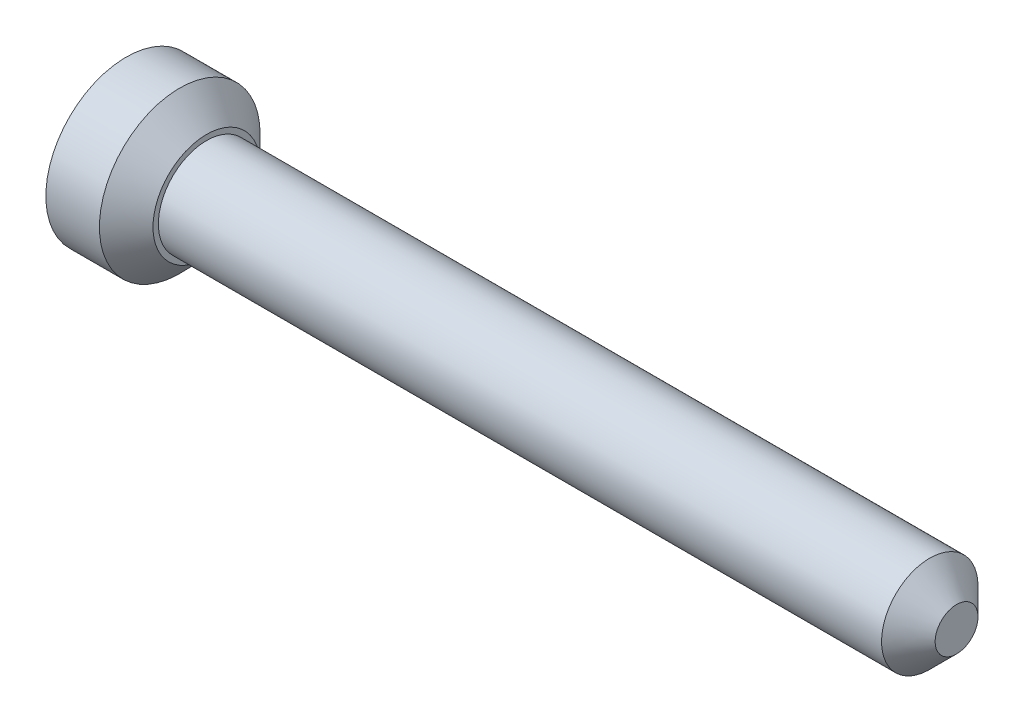
ISO-10303-21;
HEADER;
FILE_DESCRIPTION(('STEP AP214'),'2;1');
FILE_NAME('part.step','',(''),(''),'','','');
FILE_SCHEMA(('AUTOMOTIVE_DESIGN { 1 0 10303 214 1 1 1 1 }'));
ENDSEC;
DATA;
#1=APPLICATION_CONTEXT('core data for automotive mechanical design processes');
#2=APPLICATION_PROTOCOL_DEFINITION('international standard','automotive_design',2000,#1);
#3=PRODUCT_CONTEXT('',#1,'mechanical');
#4=PRODUCT('Part','Part','',(#3));
#5=PRODUCT_RELATED_PRODUCT_CATEGORY('part','',(#4));
#6=PRODUCT_DEFINITION_FORMATION('','',#4);
#7=PRODUCT_DEFINITION_CONTEXT('part definition',#1,'design');
#8=PRODUCT_DEFINITION('design','',#6,#7);
#9=PRODUCT_DEFINITION_SHAPE('','',#8);
#10=(LENGTH_UNIT() NAMED_UNIT(*) SI_UNIT(.MILLI.,.METRE.));
#11=(NAMED_UNIT(*) PLANE_ANGLE_UNIT() SI_UNIT($,.RADIAN.));
#12=(NAMED_UNIT(*) SI_UNIT($,.STERADIAN.) SOLID_ANGLE_UNIT());
#13=UNCERTAINTY_MEASURE_WITH_UNIT(LENGTH_MEASURE(1.E-05),#10,'distance_accuracy_value','');
#14=(GEOMETRIC_REPRESENTATION_CONTEXT(3) GLOBAL_UNCERTAINTY_ASSIGNED_CONTEXT((#13)) GLOBAL_UNIT_ASSIGNED_CONTEXT((#10,
#11,#12)) REPRESENTATION_CONTEXT('',''));
#15=CARTESIAN_POINT('',(0.,0.,0.));
#16=DIRECTION('',(0.,0.,1.));
#17=DIRECTION('',(1.,0.,0.));
#18=AXIS2_PLACEMENT_3D('',#15,#16,#17);
#19=CARTESIAN_POINT('',(14.,0.,0.));
#20=DIRECTION('',(-1.,0.,0.));
#21=DIRECTION('',(0.,0.,1.));
#22=AXIS2_PLACEMENT_3D('',#19,#20,#21);
#23=CYLINDRICAL_SURFACE('',#22,0.9);
#24=CARTESIAN_POINT('',(13.5,0.,0.));
#25=DIRECTION('',(1.,0.,0.));
#26=DIRECTION('',(0.,0.,-1.));
#27=AXIS2_PLACEMENT_3D('',#24,#25,#26);
#28=CIRCLE('',#27,0.9);
#29=CARTESIAN_POINT('',(13.5,0.,-0.9));
#30=VERTEX_POINT('',#29);
#31=EDGE_CURVE('E48',#30,#30,#28,.F.);
#32=ORIENTED_EDGE('',*,*,#31,.T.);
#33=EDGE_LOOP('',(#32));
#34=FACE_BOUND('',#33,.T.);
#35=CARTESIAN_POINT('',(0.,0.,0.));
#36=DIRECTION('',(1.,0.,0.));
#37=DIRECTION('',(0.,0.,-1.));
#38=AXIS2_PLACEMENT_3D('',#35,#36,#37);
#39=CIRCLE('',#38,0.9);
#40=CARTESIAN_POINT('',(0.,0.,-0.9));
#41=VERTEX_POINT('',#40);
#42=EDGE_CURVE('E57',#41,#41,#39,.T.);
#43=ORIENTED_EDGE('',*,*,#42,.T.);
#44=EDGE_LOOP('',(#43));
#45=FACE_BOUND('',#44,.T.);
#46=ADVANCED_FACE('F36',(#34,#45),#23,.T.);
#47=CARTESIAN_POINT('',(14.,0.,0.));
#48=DIRECTION('',(1.,0.,0.));
#49=DIRECTION('',(0.,0.,-1.));
#50=AXIS2_PLACEMENT_3D('',#47,#48,#49);
#51=PLANE('',#50);
#52=CARTESIAN_POINT('',(14.,0.,0.));
#53=DIRECTION('',(1.,0.,0.));
#54=DIRECTION('',(0.,0.,-1.));
#55=AXIS2_PLACEMENT_3D('',#52,#53,#54);
#56=CIRCLE('',#55,0.399999999999999);
#57=CARTESIAN_POINT('',(14.,0.,-0.399999999999999));
#58=VERTEX_POINT('',#57);
#59=EDGE_CURVE('E52',#58,#58,#56,.T.);
#60=ORIENTED_EDGE('',*,*,#59,.T.);
#61=EDGE_LOOP('',(#60));
#62=FACE_BOUND('',#61,.T.);
#63=ADVANCED_FACE('F76',(#62),#51,.T.);
#64=CARTESIAN_POINT('',(-1.5,0.,0.));
#65=DIRECTION('',(1.,0.,0.));
#66=DIRECTION('',(0.,0.,-1.));
#67=AXIS2_PLACEMENT_3D('',#64,#65,#66);
#68=CYLINDRICAL_SURFACE('',#67,1.5);
#69=CARTESIAN_POINT('',(-0.500000000000001,0.,0.));
#70=DIRECTION('',(1.,0.,0.));
#71=DIRECTION('',(0.,0.,-1.));
#72=AXIS2_PLACEMENT_3D('',#69,#70,#71);
#73=CIRCLE('',#72,1.5);
#74=CARTESIAN_POINT('',(-0.500000000000001,0.,-1.5));
#75=VERTEX_POINT('',#74);
#76=EDGE_CURVE('E10',#75,#75,#73,.F.);
#77=ORIENTED_EDGE('',*,*,#76,.T.);
#78=EDGE_LOOP('',(#77));
#79=FACE_BOUND('',#78,.T.);
#80=CARTESIAN_POINT('',(-1.5,0.,0.));
#81=DIRECTION('',(1.,0.,0.));
#82=DIRECTION('',(0.,0.,-1.));
#83=AXIS2_PLACEMENT_3D('',#80,#81,#82);
#84=CIRCLE('',#83,1.5);
#85=CARTESIAN_POINT('',(-1.5,0.,-1.5));
#86=VERTEX_POINT('',#85);
#87=EDGE_CURVE('E60',#86,#86,#84,.T.);
#88=ORIENTED_EDGE('',*,*,#87,.T.);
#89=EDGE_LOOP('',(#88));
#90=FACE_BOUND('',#89,.T.);
#91=ADVANCED_FACE('F64',(#79,#90),#68,.T.);
#92=CARTESIAN_POINT('',(-1.5,0.,0.));
#93=DIRECTION('',(1.,0.,0.));
#94=DIRECTION('',(0.,0.,-1.));
#95=AXIS2_PLACEMENT_3D('',#92,#93,#94);
#96=PLANE('',#95);
#97=ORIENTED_EDGE('',*,*,#87,.F.);
#98=EDGE_LOOP('',(#97));
#99=FACE_BOUND('',#98,.T.);
#100=ADVANCED_FACE('F66',(#99),#96,.F.);
#101=CARTESIAN_POINT('',(0.,0.,0.));
#102=DIRECTION('',(1.,0.,0.));
#103=DIRECTION('',(0.,0.,-1.));
#104=AXIS2_PLACEMENT_3D('',#101,#102,#103);
#105=PLANE('',#104);
#106=CARTESIAN_POINT('',(0.,0.,0.));
#107=DIRECTION('',(1.,0.,0.));
#108=DIRECTION('',(0.,0.,-1.));
#109=AXIS2_PLACEMENT_3D('',#106,#107,#108);
#110=CIRCLE('',#109,1.);
#111=CARTESIAN_POINT('',(0.,0.,-1.));
#112=VERTEX_POINT('',#111);
#113=EDGE_CURVE('E44',#112,#112,#110,.T.);
#114=ORIENTED_EDGE('',*,*,#113,.T.);
#115=EDGE_LOOP('',(#114));
#116=FACE_BOUND('',#115,.T.);
#117=ORIENTED_EDGE('',*,*,#42,.F.);
#118=EDGE_LOOP('',(#117));
#119=FACE_BOUND('',#118,.T.);
#120=ADVANCED_FACE('F68',(#116,#119),#105,.T.);
#121=CARTESIAN_POINT('',(14.,0.,0.));
#122=DIRECTION('',(-1.,0.,0.));
#123=DIRECTION('',(0.,0.,1.));
#124=AXIS2_PLACEMENT_3D('',#121,#122,#123);
#125=CONICAL_SURFACE('',#124,0.399999999999999,0.785398163397447);
#126=ORIENTED_EDGE('',*,*,#31,.F.);
#127=EDGE_LOOP('',(#126));
#128=FACE_BOUND('',#127,.T.);
#129=ORIENTED_EDGE('',*,*,#59,.F.);
#130=EDGE_LOOP('',(#129));
#131=FACE_BOUND('',#130,.T.);
#132=ADVANCED_FACE('F74',(#128,#131),#125,.T.);
#133=CARTESIAN_POINT('',(0.,0.,0.));
#134=DIRECTION('',(-1.,0.,0.));
#135=DIRECTION('',(0.,0.,1.));
#136=AXIS2_PLACEMENT_3D('',#133,#134,#135);
#137=CONICAL_SURFACE('',#136,1.,0.785398163397446);
#138=ORIENTED_EDGE('',*,*,#76,.F.);
#139=EDGE_LOOP('',(#138));
#140=FACE_BOUND('',#139,.T.);
#141=ORIENTED_EDGE('',*,*,#113,.F.);
#142=EDGE_LOOP('',(#141));
#143=FACE_BOUND('',#142,.T.);
#144=ADVANCED_FACE('F39',(#140,#143),#137,.T.);
#145=CLOSED_SHELL('',(#46,#63,#91,#100,#120,#132,#144));
#146=MANIFOLD_SOLID_BREP('B2',#145);
#147=ADVANCED_BREP_SHAPE_REPRESENTATION('',(#18,#146),#14);
#148=SHAPE_DEFINITION_REPRESENTATION(#9,#147);
ENDSEC;
END-ISO-10303-21;
